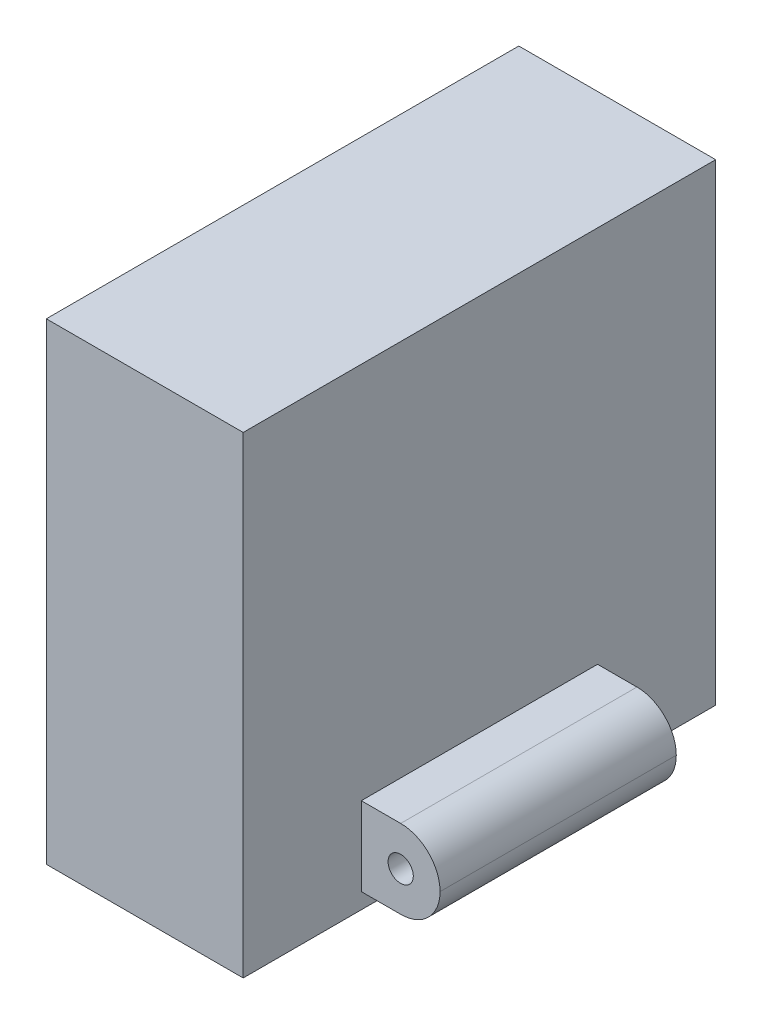
ISO-10303-21;
HEADER;
FILE_DESCRIPTION(('STEP AP214'),'2;1');
FILE_NAME('part.step','',(''),(''),'','','');
FILE_SCHEMA(('AUTOMOTIVE_DESIGN { 1 0 10303 214 1 1 1 1 }'));
ENDSEC;
DATA;
#1=APPLICATION_CONTEXT('core data for automotive mechanical design processes');
#2=APPLICATION_PROTOCOL_DEFINITION('international standard','automotive_design',2000,#1);
#3=PRODUCT_CONTEXT('',#1,'mechanical');
#4=PRODUCT('Part','Part','',(#3));
#5=PRODUCT_RELATED_PRODUCT_CATEGORY('part','',(#4));
#6=PRODUCT_DEFINITION_FORMATION('','',#4);
#7=PRODUCT_DEFINITION_CONTEXT('part definition',#1,'design');
#8=PRODUCT_DEFINITION('design','',#6,#7);
#9=PRODUCT_DEFINITION_SHAPE('','',#8);
#10=(LENGTH_UNIT() NAMED_UNIT(*) SI_UNIT(.MILLI.,.METRE.));
#11=(NAMED_UNIT(*) PLANE_ANGLE_UNIT() SI_UNIT($,.RADIAN.));
#12=(NAMED_UNIT(*) SI_UNIT($,.STERADIAN.) SOLID_ANGLE_UNIT());
#13=UNCERTAINTY_MEASURE_WITH_UNIT(LENGTH_MEASURE(1.E-05),#10,'distance_accuracy_value','');
#14=(GEOMETRIC_REPRESENTATION_CONTEXT(3) GLOBAL_UNCERTAINTY_ASSIGNED_CONTEXT((#13)) GLOBAL_UNIT_ASSIGNED_CONTEXT((#10,
#11,#12)) REPRESENTATION_CONTEXT('',''));
#15=CARTESIAN_POINT('',(0.,0.,0.));
#16=DIRECTION('',(0.,0.,1.));
#17=DIRECTION('',(1.,0.,0.));
#18=AXIS2_PLACEMENT_3D('',#15,#16,#17);
#19=CARTESIAN_POINT('',(25.,60.,0.));
#20=DIRECTION('',(-1.,0.,0.));
#21=DIRECTION('',(0.,0.,1.));
#22=AXIS2_PLACEMENT_3D('',#19,#20,#21);
#23=PLANE('',#22);
#24=DIRECTION('',(0.,0.,-1.));
#25=VECTOR('',#24,1.);
#26=CARTESIAN_POINT('',(25.,0.,0.));
#27=LINE('',#26,#25);
#28=CARTESIAN_POINT('',(25.,0.,0.));
#29=VERTEX_POINT('',#28);
#30=CARTESIAN_POINT('',(25.,0.,-60.));
#31=VERTEX_POINT('',#30);
#32=EDGE_CURVE('E174',#29,#31,#27,.T.);
#33=ORIENTED_EDGE('',*,*,#32,.T.);
#34=DIRECTION('',(0.,-1.,0.));
#35=VECTOR('',#34,1.);
#36=CARTESIAN_POINT('',(25.,60.,-60.));
#37=LINE('',#36,#35);
#38=CARTESIAN_POINT('',(25.,60.,-60.));
#39=VERTEX_POINT('',#38);
#40=EDGE_CURVE('E182',#39,#31,#37,.T.);
#41=ORIENTED_EDGE('',*,*,#40,.F.);
#42=DIRECTION('',(0.,0.,-1.));
#43=VECTOR('',#42,1.);
#44=CARTESIAN_POINT('',(25.,60.,0.));
#45=LINE('',#44,#43);
#46=CARTESIAN_POINT('',(25.,60.,0.));
#47=VERTEX_POINT('',#46);
#48=EDGE_CURVE('E161',#47,#39,#45,.T.);
#49=ORIENTED_EDGE('',*,*,#48,.F.);
#50=DIRECTION('',(0.,-1.,0.));
#51=VECTOR('',#50,1.);
#52=CARTESIAN_POINT('',(25.,60.,0.));
#53=LINE('',#52,#51);
#54=EDGE_CURVE('E186',#47,#29,#53,.T.);
#55=ORIENTED_EDGE('',*,*,#54,.T.);
#56=EDGE_LOOP('',(#33,#41,#49,#55));
#57=FACE_BOUND('',#56,.T.);
#58=DIRECTION('',(0.,0.,-1.));
#59=VECTOR('',#58,1.);
#60=CARTESIAN_POINT('',(25.,2.,-15.));
#61=LINE('',#60,#59);
#62=CARTESIAN_POINT('',(25.,2.,-15.));
#63=VERTEX_POINT('',#62);
#64=CARTESIAN_POINT('',(25.,2.,-45.));
#65=VERTEX_POINT('',#64);
#66=EDGE_CURVE('E118',#63,#65,#61,.T.);
#67=ORIENTED_EDGE('',*,*,#66,.F.);
#68=DIRECTION('',(0.,-1.,0.));
#69=VECTOR('',#68,1.);
#70=CARTESIAN_POINT('',(25.,12.,-15.));
#71=LINE('',#70,#69);
#72=CARTESIAN_POINT('',(25.,12.,-15.));
#73=VERTEX_POINT('',#72);
#74=EDGE_CURVE('E124',#73,#63,#71,.T.);
#75=ORIENTED_EDGE('',*,*,#74,.F.);
#76=DIRECTION('',(0.,0.,-1.));
#77=VECTOR('',#76,1.);
#78=CARTESIAN_POINT('',(25.,12.,-15.));
#79=LINE('',#78,#77);
#80=CARTESIAN_POINT('',(25.,12.,-45.));
#81=VERTEX_POINT('',#80);
#82=EDGE_CURVE('E138',#73,#81,#79,.T.);
#83=ORIENTED_EDGE('',*,*,#82,.T.);
#84=DIRECTION('',(0.,-1.,0.));
#85=VECTOR('',#84,1.);
#86=CARTESIAN_POINT('',(25.,12.,-45.));
#87=LINE('',#86,#85);
#88=EDGE_CURVE('E132',#81,#65,#87,.T.);
#89=ORIENTED_EDGE('',*,*,#88,.T.);
#90=EDGE_LOOP('',(#67,#75,#83,#89));
#91=FACE_BOUND('',#90,.T.);
#92=ADVANCED_FACE('F45',(#57,#91),#23,.F.);
#93=CARTESIAN_POINT('',(0.,60.,0.));
#94=DIRECTION('',(1.,0.,0.));
#95=DIRECTION('',(0.,0.,-1.));
#96=AXIS2_PLACEMENT_3D('',#93,#94,#95);
#97=PLANE('',#96);
#98=DIRECTION('',(0.,0.,1.));
#99=VECTOR('',#98,1.);
#100=CARTESIAN_POINT('',(0.,0.,0.));
#101=LINE('',#100,#99);
#102=CARTESIAN_POINT('',(0.,0.,-60.));
#103=VERTEX_POINT('',#102);
#104=CARTESIAN_POINT('',(0.,0.,0.));
#105=VERTEX_POINT('',#104);
#106=EDGE_CURVE('E152',#103,#105,#101,.T.);
#107=ORIENTED_EDGE('',*,*,#106,.T.);
#108=DIRECTION('',(0.,-1.,0.));
#109=VECTOR('',#108,1.);
#110=CARTESIAN_POINT('',(0.,60.,0.));
#111=LINE('',#110,#109);
#112=CARTESIAN_POINT('',(0.,60.,0.));
#113=VERTEX_POINT('',#112);
#114=EDGE_CURVE('E190',#113,#105,#111,.T.);
#115=ORIENTED_EDGE('',*,*,#114,.F.);
#116=DIRECTION('',(0.,0.,1.));
#117=VECTOR('',#116,1.);
#118=CARTESIAN_POINT('',(0.,60.,0.));
#119=LINE('',#118,#117);
#120=CARTESIAN_POINT('',(0.,60.,-60.));
#121=VERTEX_POINT('',#120);
#122=EDGE_CURVE('E153',#121,#113,#119,.T.);
#123=ORIENTED_EDGE('',*,*,#122,.F.);
#124=DIRECTION('',(0.,-1.,0.));
#125=VECTOR('',#124,1.);
#126=CARTESIAN_POINT('',(0.,60.,-60.));
#127=LINE('',#126,#125);
#128=EDGE_CURVE('E167',#121,#103,#127,.T.);
#129=ORIENTED_EDGE('',*,*,#128,.T.);
#130=EDGE_LOOP('',(#107,#115,#123,#129));
#131=FACE_BOUND('',#130,.T.);
#132=ADVANCED_FACE('F241',(#131),#97,.F.);
#133=CARTESIAN_POINT('',(0.,60.,0.));
#134=DIRECTION('',(0.,0.,-1.));
#135=DIRECTION('',(-1.,0.,0.));
#136=AXIS2_PLACEMENT_3D('',#133,#134,#135);
#137=PLANE('',#136);
#138=DIRECTION('',(1.,0.,0.));
#139=VECTOR('',#138,1.);
#140=CARTESIAN_POINT('',(0.,0.,0.));
#141=LINE('',#140,#139);
#142=EDGE_CURVE('E171',#105,#29,#141,.T.);
#143=ORIENTED_EDGE('',*,*,#142,.T.);
#144=ORIENTED_EDGE('',*,*,#54,.F.);
#145=DIRECTION('',(1.,0.,0.));
#146=VECTOR('',#145,1.);
#147=CARTESIAN_POINT('',(0.,60.,0.));
#148=LINE('',#147,#146);
#149=EDGE_CURVE('E157',#113,#47,#148,.T.);
#150=ORIENTED_EDGE('',*,*,#149,.F.);
#151=ORIENTED_EDGE('',*,*,#114,.T.);
#152=EDGE_LOOP('',(#143,#144,#150,#151));
#153=FACE_BOUND('',#152,.T.);
#154=ADVANCED_FACE('F249',(#153),#137,.F.);
#155=CARTESIAN_POINT('',(0.,60.,-60.));
#156=DIRECTION('',(0.,0.,1.));
#157=DIRECTION('',(1.,0.,0.));
#158=AXIS2_PLACEMENT_3D('',#155,#156,#157);
#159=PLANE('',#158);
#160=DIRECTION('',(-1.,0.,0.));
#161=VECTOR('',#160,1.);
#162=CARTESIAN_POINT('',(0.,0.,-60.));
#163=LINE('',#162,#161);
#164=EDGE_CURVE('E158',#31,#103,#163,.T.);
#165=ORIENTED_EDGE('',*,*,#164,.T.);
#166=ORIENTED_EDGE('',*,*,#128,.F.);
#167=DIRECTION('',(-1.,0.,0.));
#168=VECTOR('',#167,1.);
#169=CARTESIAN_POINT('',(0.,60.,-60.));
#170=LINE('',#169,#168);
#171=EDGE_CURVE('E164',#39,#121,#170,.T.);
#172=ORIENTED_EDGE('',*,*,#171,.F.);
#173=ORIENTED_EDGE('',*,*,#40,.T.);
#174=EDGE_LOOP('',(#165,#166,#172,#173));
#175=FACE_BOUND('',#174,.T.);
#176=ADVANCED_FACE('F254',(#175),#159,.F.);
#177=CARTESIAN_POINT('',(0.,60.,0.));
#178=DIRECTION('',(0.,-1.,0.));
#179=DIRECTION('',(0.,0.,-1.));
#180=AXIS2_PLACEMENT_3D('',#177,#178,#179);
#181=PLANE('',#180);
#182=ORIENTED_EDGE('',*,*,#122,.T.);
#183=ORIENTED_EDGE('',*,*,#149,.T.);
#184=ORIENTED_EDGE('',*,*,#48,.T.);
#185=ORIENTED_EDGE('',*,*,#171,.T.);
#186=EDGE_LOOP('',(#182,#183,#184,#185));
#187=FACE_BOUND('',#186,.T.);
#188=ADVANCED_FACE('F302',(#187),#181,.F.);
#189=CARTESIAN_POINT('',(0.,0.,0.));
#190=DIRECTION('',(0.,-1.,0.));
#191=DIRECTION('',(0.,0.,-1.));
#192=AXIS2_PLACEMENT_3D('',#189,#190,#191);
#193=PLANE('',#192);
#194=ORIENTED_EDGE('',*,*,#106,.F.);
#195=ORIENTED_EDGE('',*,*,#164,.F.);
#196=ORIENTED_EDGE('',*,*,#32,.F.);
#197=ORIENTED_EDGE('',*,*,#142,.F.);
#198=EDGE_LOOP('',(#194,#195,#196,#197));
#199=FACE_BOUND('',#198,.T.);
#200=ADVANCED_FACE('F238',(#199),#193,.T.);
#201=CARTESIAN_POINT('',(35.,2.,-15.));
#202=DIRECTION('',(0.,1.,0.));
#203=DIRECTION('',(0.,0.,1.));
#204=AXIS2_PLACEMENT_3D('',#201,#202,#203);
#205=PLANE('',#204);
#206=DIRECTION('',(-1.,0.,0.));
#207=VECTOR('',#206,1.);
#208=CARTESIAN_POINT('',(35.,2.,-45.));
#209=LINE('',#208,#207);
#210=CARTESIAN_POINT('',(30.,2.,-45.));
#211=VERTEX_POINT('',#210);
#212=EDGE_CURVE('E149',#211,#65,#209,.T.);
#213=ORIENTED_EDGE('',*,*,#212,.F.);
#214=DIRECTION('',(0.,0.,-1.));
#215=VECTOR('',#214,1.);
#216=CARTESIAN_POINT('',(30.,2.,-15.));
#217=LINE('',#216,#215);
#218=CARTESIAN_POINT('',(30.,2.,-15.));
#219=VERTEX_POINT('',#218);
#220=EDGE_CURVE('E120',#211,#219,#217,.F.);
#221=ORIENTED_EDGE('',*,*,#220,.T.);
#222=DIRECTION('',(-1.,0.,0.));
#223=VECTOR('',#222,1.);
#224=CARTESIAN_POINT('',(35.,2.,-15.));
#225=LINE('',#224,#223);
#226=EDGE_CURVE('E114',#219,#63,#225,.T.);
#227=ORIENTED_EDGE('',*,*,#226,.T.);
#228=ORIENTED_EDGE('',*,*,#66,.T.);
#229=EDGE_LOOP('',(#213,#221,#227,#228));
#230=FACE_BOUND('',#229,.T.);
#231=ADVANCED_FACE('F117',(#230),#205,.F.);
#232=CARTESIAN_POINT('',(35.,12.,-45.));
#233=DIRECTION('',(0.,0.,-1.));
#234=DIRECTION('',(-1.,0.,0.));
#235=AXIS2_PLACEMENT_3D('',#232,#233,#234);
#236=PLANE('',#235);
#237=CARTESIAN_POINT('',(30.,7.,-45.));
#238=DIRECTION('',(0.,0.,-1.));
#239=DIRECTION('',(-1.,0.,0.));
#240=AXIS2_PLACEMENT_3D('',#237,#238,#239);
#241=CIRCLE('',#240,1.6);
#242=CARTESIAN_POINT('',(28.4,7.,-45.));
#243=VERTEX_POINT('',#242);
#244=EDGE_CURVE('E198',#243,#243,#241,.T.);
#245=ORIENTED_EDGE('',*,*,#244,.F.);
#246=EDGE_LOOP('',(#245));
#247=FACE_BOUND('',#246,.T.);
#248=CARTESIAN_POINT('',(30.,7.,-45.));
#249=DIRECTION('',(0.,0.,-1.));
#250=DIRECTION('',(-1.,0.,0.));
#251=AXIS2_PLACEMENT_3D('',#248,#249,#250);
#252=CIRCLE('',#251,5.);
#253=CARTESIAN_POINT('',(30.,12.,-45.));
#254=VERTEX_POINT('',#253);
#255=CARTESIAN_POINT('',(35.,7.,-45.));
#256=VERTEX_POINT('',#255);
#257=EDGE_CURVE('E194',#254,#256,#252,.T.);
#258=ORIENTED_EDGE('',*,*,#257,.T.);
#259=CARTESIAN_POINT('',(30.,7.,-45.));
#260=DIRECTION('',(0.,0.,-1.));
#261=DIRECTION('',(-1.,0.,0.));
#262=AXIS2_PLACEMENT_3D('',#259,#260,#261);
#263=CIRCLE('',#262,5.);
#264=EDGE_CURVE('E201',#256,#211,#263,.T.);
#265=ORIENTED_EDGE('',*,*,#264,.T.);
#266=ORIENTED_EDGE('',*,*,#212,.T.);
#267=ORIENTED_EDGE('',*,*,#88,.F.);
#268=DIRECTION('',(-1.,0.,0.));
#269=VECTOR('',#268,1.);
#270=CARTESIAN_POINT('',(35.,12.,-45.));
#271=LINE('',#270,#269);
#272=EDGE_CURVE('E146',#254,#81,#271,.T.);
#273=ORIENTED_EDGE('',*,*,#272,.F.);
#274=EDGE_LOOP('',(#258,#265,#266,#267,#273));
#275=FACE_BOUND('',#274,.T.);
#276=ADVANCED_FACE('F211',(#247,#275),#236,.T.);
#277=CARTESIAN_POINT('',(35.,12.,-15.));
#278=DIRECTION('',(0.,1.,0.));
#279=DIRECTION('',(0.,0.,1.));
#280=AXIS2_PLACEMENT_3D('',#277,#278,#279);
#281=PLANE('',#280);
#282=DIRECTION('',(-1.,0.,0.));
#283=VECTOR('',#282,1.);
#284=CARTESIAN_POINT('',(35.,12.,-15.));
#285=LINE('',#284,#283);
#286=CARTESIAN_POINT('',(30.,12.,-15.));
#287=VERTEX_POINT('',#286);
#288=EDGE_CURVE('E123',#287,#73,#285,.T.);
#289=ORIENTED_EDGE('',*,*,#288,.F.);
#290=DIRECTION('',(0.,0.,-1.));
#291=VECTOR('',#290,1.);
#292=CARTESIAN_POINT('',(30.,12.,-45.));
#293=LINE('',#292,#291);
#294=EDGE_CURVE('E11',#287,#254,#293,.T.);
#295=ORIENTED_EDGE('',*,*,#294,.T.);
#296=ORIENTED_EDGE('',*,*,#272,.T.);
#297=ORIENTED_EDGE('',*,*,#82,.F.);
#298=EDGE_LOOP('',(#289,#295,#296,#297));
#299=FACE_BOUND('',#298,.T.);
#300=ADVANCED_FACE('F230',(#299),#281,.T.);
#301=CARTESIAN_POINT('',(35.,12.,-15.));
#302=DIRECTION('',(0.,0.,-1.));
#303=DIRECTION('',(-1.,0.,0.));
#304=AXIS2_PLACEMENT_3D('',#301,#302,#303);
#305=PLANE('',#304);
#306=CARTESIAN_POINT('',(30.,7.,-15.));
#307=DIRECTION('',(0.,0.,-1.));
#308=DIRECTION('',(-1.,0.,0.));
#309=AXIS2_PLACEMENT_3D('',#306,#307,#308);
#310=CIRCLE('',#309,1.6);
#311=CARTESIAN_POINT('',(28.4,7.,-15.));
#312=VERTEX_POINT('',#311);
#313=EDGE_CURVE('E134',#312,#312,#310,.T.);
#314=ORIENTED_EDGE('',*,*,#313,.T.);
#315=EDGE_LOOP('',(#314));
#316=FACE_BOUND('',#315,.T.);
#317=ORIENTED_EDGE('',*,*,#226,.F.);
#318=CARTESIAN_POINT('',(30.,7.,-15.));
#319=DIRECTION('',(0.,0.,-1.));
#320=DIRECTION('',(-1.,0.,0.));
#321=AXIS2_PLACEMENT_3D('',#318,#319,#320);
#322=CIRCLE('',#321,5.);
#323=CARTESIAN_POINT('',(35.,7.,-15.));
#324=VERTEX_POINT('',#323);
#325=EDGE_CURVE('E55',#219,#324,#322,.F.);
#326=ORIENTED_EDGE('',*,*,#325,.T.);
#327=CARTESIAN_POINT('',(30.,7.,-15.));
#328=DIRECTION('',(0.,0.,-1.));
#329=DIRECTION('',(-1.,0.,0.));
#330=AXIS2_PLACEMENT_3D('',#327,#328,#329);
#331=CIRCLE('',#330,5.);
#332=EDGE_CURVE('E62',#324,#287,#331,.F.);
#333=ORIENTED_EDGE('',*,*,#332,.T.);
#334=ORIENTED_EDGE('',*,*,#288,.T.);
#335=ORIENTED_EDGE('',*,*,#74,.T.);
#336=EDGE_LOOP('',(#317,#326,#333,#334,#335));
#337=FACE_BOUND('',#336,.T.);
#338=ADVANCED_FACE('F136',(#316,#337),#305,.F.);
#339=CARTESIAN_POINT('',(30.,7.,0.));
#340=DIRECTION('',(0.,0.,-1.));
#341=DIRECTION('',(-1.,0.,0.));
#342=AXIS2_PLACEMENT_3D('',#339,#340,#341);
#343=CYLINDRICAL_SURFACE('',#342,1.6);
#344=CARTESIAN_POINT('',(28.4,7.,-45.));
#345=CARTESIAN_POINT('',(28.4,7.,-44.6875));
#346=CARTESIAN_POINT('',(28.4,7.,-44.375));
#347=CARTESIAN_POINT('',(28.4,7.,-43.75));
#348=CARTESIAN_POINT('',(28.4,7.,-43.4375));
#349=CARTESIAN_POINT('',(28.4,7.,-42.8125));
#350=CARTESIAN_POINT('',(28.4,7.,-42.5));
#351=CARTESIAN_POINT('',(28.4,7.,-41.875));
#352=CARTESIAN_POINT('',(28.4,7.,-41.5625));
#353=CARTESIAN_POINT('',(28.4,7.,-40.9375));
#354=CARTESIAN_POINT('',(28.4,7.,-40.625));
#355=CARTESIAN_POINT('',(28.4,7.,-40.));
#356=CARTESIAN_POINT('',(28.4,7.,-39.6875));
#357=CARTESIAN_POINT('',(28.4,7.,-39.0625));
#358=CARTESIAN_POINT('',(28.4,7.,-38.75));
#359=CARTESIAN_POINT('',(28.4,7.,-38.125));
#360=CARTESIAN_POINT('',(28.4,7.,-37.8125));
#361=CARTESIAN_POINT('',(28.4,7.,-37.1875));
#362=CARTESIAN_POINT('',(28.4,7.,-36.875));
#363=CARTESIAN_POINT('',(28.4,7.,-36.25));
#364=CARTESIAN_POINT('',(28.4,7.,-35.9375));
#365=CARTESIAN_POINT('',(28.4,7.,-35.3125));
#366=CARTESIAN_POINT('',(28.4,7.,-35.));
#367=CARTESIAN_POINT('',(28.4,7.,-34.375));
#368=CARTESIAN_POINT('',(28.4,7.,-34.0625));
#369=CARTESIAN_POINT('',(28.4,7.,-33.4375));
#370=CARTESIAN_POINT('',(28.4,7.,-33.125));
#371=CARTESIAN_POINT('',(28.4,7.,-32.5));
#372=CARTESIAN_POINT('',(28.4,7.,-32.1875));
#373=CARTESIAN_POINT('',(28.4,7.,-31.5625));
#374=CARTESIAN_POINT('',(28.4,7.,-31.25));
#375=CARTESIAN_POINT('',(28.4,7.,-30.625));
#376=CARTESIAN_POINT('',(28.4,7.,-30.3125));
#377=CARTESIAN_POINT('',(28.4,7.,-29.6875));
#378=CARTESIAN_POINT('',(28.4,7.,-29.375));
#379=CARTESIAN_POINT('',(28.4,7.,-28.75));
#380=CARTESIAN_POINT('',(28.4,7.,-28.4375));
#381=CARTESIAN_POINT('',(28.4,7.,-27.8125));
#382=CARTESIAN_POINT('',(28.4,7.,-27.5));
#383=CARTESIAN_POINT('',(28.4,7.,-26.875));
#384=CARTESIAN_POINT('',(28.4,7.,-26.5625));
#385=CARTESIAN_POINT('',(28.4,7.,-25.9375));
#386=CARTESIAN_POINT('',(28.4,7.,-25.625));
#387=CARTESIAN_POINT('',(28.4,7.,-25.));
#388=CARTESIAN_POINT('',(28.4,7.,-24.6875));
#389=CARTESIAN_POINT('',(28.4,7.,-24.0625));
#390=CARTESIAN_POINT('',(28.4,7.,-23.75));
#391=CARTESIAN_POINT('',(28.4,7.,-23.125));
#392=CARTESIAN_POINT('',(28.4,7.,-22.8125));
#393=CARTESIAN_POINT('',(28.4,7.,-22.1875));
#394=CARTESIAN_POINT('',(28.4,7.,-21.875));
#395=CARTESIAN_POINT('',(28.4,7.,-21.25));
#396=CARTESIAN_POINT('',(28.4,7.,-20.9375));
#397=CARTESIAN_POINT('',(28.4,7.,-20.3125));
#398=CARTESIAN_POINT('',(28.4,7.,-20.));
#399=CARTESIAN_POINT('',(28.4,7.,-19.375));
#400=CARTESIAN_POINT('',(28.4,7.,-19.0625));
#401=CARTESIAN_POINT('',(28.4,7.,-18.4375));
#402=CARTESIAN_POINT('',(28.4,7.,-18.125));
#403=CARTESIAN_POINT('',(28.4,7.,-17.5));
#404=CARTESIAN_POINT('',(28.4,7.,-17.1875));
#405=CARTESIAN_POINT('',(28.4,7.,-16.5625));
#406=CARTESIAN_POINT('',(28.4,7.,-16.25));
#407=CARTESIAN_POINT('',(28.4,7.,-15.625));
#408=CARTESIAN_POINT('',(28.4,7.,-15.3125));
#409=CARTESIAN_POINT('',(28.4,7.,-15.));
#410=B_SPLINE_CURVE_WITH_KNOTS('',3,(#344,#345,#346,#347,#348,#349,#350,#351,#352,#353,#354,
#355,#356,#357,#358,#359,#360,#361,#362,#363,#364,#365,#366,#367,#368,#369,#370,#371,#372,#373,
#374,#375,#376,#377,#378,#379,#380,#381,#382,#383,#384,#385,#386,#387,#388,#389,#390,#391,#392,
#393,#394,#395,#396,#397,#398,#399,#400,#401,#402,#403,#404,#405,#406,#407,#408,#409),
.UNSPECIFIED.,.F.,.F.,(4,2,2,2,2,2,2,2,2,2,2,2,2,2,2,2,2,2,2,2,2,2,2,2,2,2,2,2,2,2,2,2,4),(0.,
0.937500000000001,1.875,2.8125,3.75,4.6875,5.625,6.5625,7.5,8.4375,9.375,10.3125,11.25,12.1875,
13.125,14.0625,15.,15.9375,16.875,17.8125,18.75,19.6875,20.625,21.5625,22.5,23.4375,24.375,
25.3125,26.25,27.1875,28.125,29.0625,30.),.UNSPECIFIED.);
#411=EDGE_CURVE('BSEAM226',#243,#312,#410,.T.);
#412=ORIENTED_EDGE('',*,*,#244,.T.);
#413=ORIENTED_EDGE('',*,*,#313,.F.);
#414=ORIENTED_EDGE('',*,*,#411,.T.);
#415=ORIENTED_EDGE('',*,*,#411,.F.);
#416=EDGE_LOOP('',(#412,#414,#413,#415));
#417=FACE_BOUND('',#416,.T.);
#418=ADVANCED_FACE('F226',(#417),#343,.F.);
#419=CARTESIAN_POINT('',(30.,7.,-15.));
#420=DIRECTION('',(0.,0.,1.));
#421=DIRECTION('',(1.,0.,0.));
#422=AXIS2_PLACEMENT_3D('',#419,#420,#421);
#423=CYLINDRICAL_SURFACE('',#422,5.);
#424=ORIENTED_EDGE('',*,*,#294,.F.);
#425=ORIENTED_EDGE('',*,*,#332,.F.);
#426=DIRECTION('',(0.,0.,-1.));
#427=VECTOR('',#426,1.);
#428=CARTESIAN_POINT('',(35.,7.,-15.));
#429=LINE('',#428,#427);
#430=EDGE_CURVE('E49',#256,#324,#429,.F.);
#431=ORIENTED_EDGE('',*,*,#430,.F.);
#432=ORIENTED_EDGE('',*,*,#257,.F.);
#433=EDGE_LOOP('',(#424,#425,#431,#432));
#434=FACE_BOUND('',#433,.T.);
#435=ADVANCED_FACE('F47',(#434),#423,.T.);
#436=CARTESIAN_POINT('',(30.,7.,0.));
#437=DIRECTION('',(0.,0.,-1.));
#438=DIRECTION('',(-1.,0.,0.));
#439=AXIS2_PLACEMENT_3D('',#436,#437,#438);
#440=CYLINDRICAL_SURFACE('',#439,5.);
#441=ORIENTED_EDGE('',*,*,#325,.F.);
#442=ORIENTED_EDGE('',*,*,#220,.F.);
#443=ORIENTED_EDGE('',*,*,#264,.F.);
#444=ORIENTED_EDGE('',*,*,#430,.T.);
#445=EDGE_LOOP('',(#441,#442,#443,#444));
#446=FACE_BOUND('',#445,.T.);
#447=ADVANCED_FACE('F217',(#446),#440,.T.);
#448=CLOSED_SHELL('',(#92,#132,#154,#176,#188,#200,#231,#276,#300,#338,#418,#435,#447));
#449=MANIFOLD_SOLID_BREP('B2',#448);
#450=ADVANCED_BREP_SHAPE_REPRESENTATION('',(#18,#449),#14);
#451=SHAPE_DEFINITION_REPRESENTATION(#9,#450);
ENDSEC;
END-ISO-10303-21;
